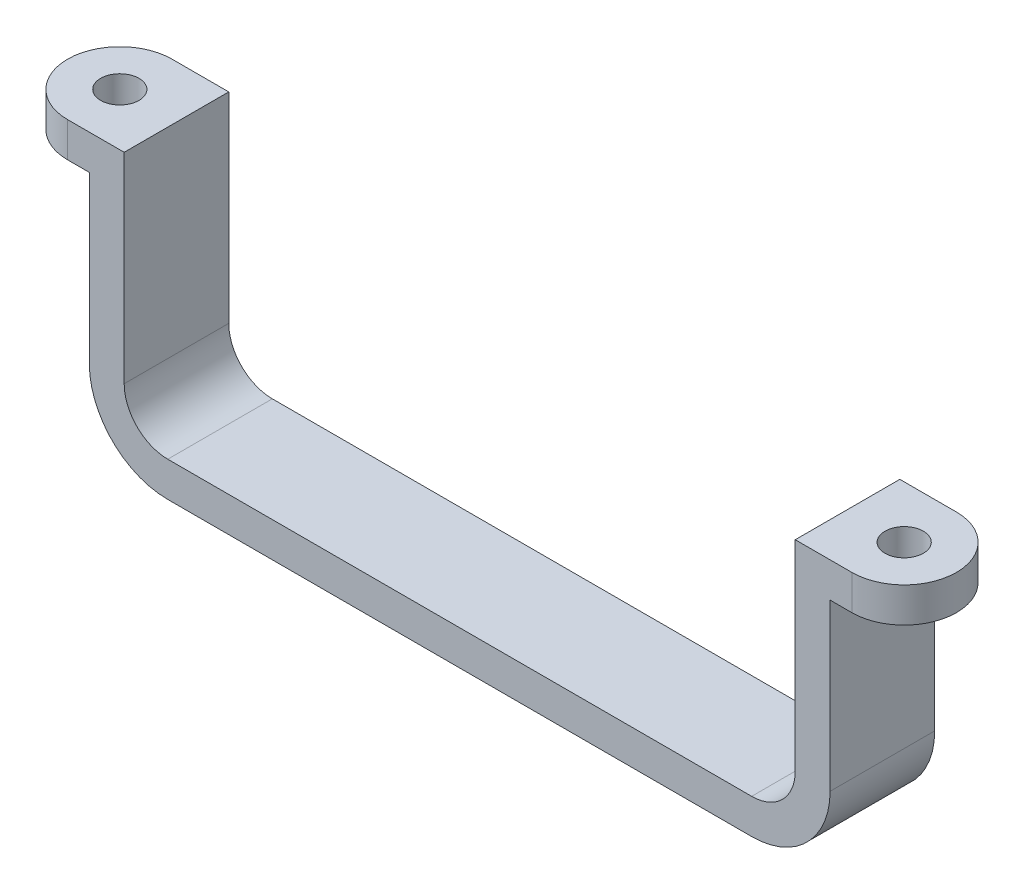
ISO-10303-21;
HEADER;
FILE_DESCRIPTION(('STEP AP214'),'2;1');
FILE_NAME('part.step','',(''),(''),'','','');
FILE_SCHEMA(('AUTOMOTIVE_DESIGN { 1 0 10303 214 1 1 1 1 }'));
ENDSEC;
DATA;
#1=APPLICATION_CONTEXT('core data for automotive mechanical design processes');
#2=APPLICATION_PROTOCOL_DEFINITION('international standard','automotive_design',2000,#1);
#3=PRODUCT_CONTEXT('',#1,'mechanical');
#4=PRODUCT('Part','Part','',(#3));
#5=PRODUCT_RELATED_PRODUCT_CATEGORY('part','',(#4));
#6=PRODUCT_DEFINITION_FORMATION('','',#4);
#7=PRODUCT_DEFINITION_CONTEXT('part definition',#1,'design');
#8=PRODUCT_DEFINITION('design','',#6,#7);
#9=PRODUCT_DEFINITION_SHAPE('','',#8);
#10=(LENGTH_UNIT() NAMED_UNIT(*) SI_UNIT(.MILLI.,.METRE.));
#11=(NAMED_UNIT(*) PLANE_ANGLE_UNIT() SI_UNIT($,.RADIAN.));
#12=(NAMED_UNIT(*) SI_UNIT($,.STERADIAN.) SOLID_ANGLE_UNIT());
#13=UNCERTAINTY_MEASURE_WITH_UNIT(LENGTH_MEASURE(1.E-05),#10,'distance_accuracy_value','');
#14=(GEOMETRIC_REPRESENTATION_CONTEXT(3) GLOBAL_UNCERTAINTY_ASSIGNED_CONTEXT((#13)) GLOBAL_UNIT_ASSIGNED_CONTEXT((#10,
#11,#12)) REPRESENTATION_CONTEXT('',''));
#15=CARTESIAN_POINT('',(0.,0.,0.));
#16=DIRECTION('',(0.,0.,1.));
#17=DIRECTION('',(1.,0.,0.));
#18=AXIS2_PLACEMENT_3D('',#15,#16,#17);
#19=CARTESIAN_POINT('',(21.25,14.,6.));
#20=DIRECTION('',(-1.,0.,0.));
#21=DIRECTION('',(0.,0.,1.));
#22=AXIS2_PLACEMENT_3D('',#19,#20,#21);
#23=PLANE('',#22);
#24=DIRECTION('',(0.,0.,-1.));
#25=VECTOR('',#24,1.);
#26=CARTESIAN_POINT('',(21.25,12.,0.));
#27=LINE('',#26,#25);
#28=CARTESIAN_POINT('',(21.25,12.,6.));
#29=VERTEX_POINT('',#28);
#30=CARTESIAN_POINT('',(21.25,12.,0.));
#31=VERTEX_POINT('',#30);
#32=EDGE_CURVE('E54',#29,#31,#27,.T.);
#33=ORIENTED_EDGE('',*,*,#32,.F.);
#34=DIRECTION('',(0.,1.,0.));
#35=VECTOR('',#34,1.);
#36=CARTESIAN_POINT('',(21.25,14.,6.));
#37=LINE('',#36,#35);
#38=CARTESIAN_POINT('',(21.25,2.5,6.));
#39=VERTEX_POINT('',#38);
#40=EDGE_CURVE('E235',#39,#29,#37,.T.);
#41=ORIENTED_EDGE('',*,*,#40,.F.);
#42=DIRECTION('',(0.,0.,-1.));
#43=VECTOR('',#42,1.);
#44=CARTESIAN_POINT('',(21.25,2.5,6.));
#45=LINE('',#44,#43);
#46=CARTESIAN_POINT('',(21.25,2.5,0.));
#47=VERTEX_POINT('',#46);
#48=EDGE_CURVE('E268',#39,#47,#45,.T.);
#49=ORIENTED_EDGE('',*,*,#48,.T.);
#50=DIRECTION('',(0.,1.,0.));
#51=VECTOR('',#50,1.);
#52=CARTESIAN_POINT('',(21.25,14.,0.));
#53=LINE('',#52,#51);
#54=EDGE_CURVE('E59',#47,#31,#53,.T.);
#55=ORIENTED_EDGE('',*,*,#54,.T.);
#56=EDGE_LOOP('',(#33,#41,#49,#55));
#57=FACE_BOUND('',#56,.T.);
#58=ADVANCED_FACE('F39',(#57),#23,.F.);
#59=CARTESIAN_POINT('',(-21.25,14.,6.));
#60=DIRECTION('',(1.,0.,0.));
#61=DIRECTION('',(0.,0.,-1.));
#62=AXIS2_PLACEMENT_3D('',#59,#60,#61);
#63=PLANE('',#62);
#64=DIRECTION('',(0.,0.,-1.));
#65=VECTOR('',#64,1.);
#66=CARTESIAN_POINT('',(-21.25,12.,0.));
#67=LINE('',#66,#65);
#68=CARTESIAN_POINT('',(-21.25,12.,6.));
#69=VERTEX_POINT('',#68);
#70=CARTESIAN_POINT('',(-21.25,12.,0.));
#71=VERTEX_POINT('',#70);
#72=EDGE_CURVE('E195',#69,#71,#67,.T.);
#73=ORIENTED_EDGE('',*,*,#72,.T.);
#74=DIRECTION('',(0.,-1.,0.));
#75=VECTOR('',#74,1.);
#76=CARTESIAN_POINT('',(-21.25,14.,0.));
#77=LINE('',#76,#75);
#78=CARTESIAN_POINT('',(-21.25,2.5,0.));
#79=VERTEX_POINT('',#78);
#80=EDGE_CURVE('E252',#71,#79,#77,.T.);
#81=ORIENTED_EDGE('',*,*,#80,.T.);
#82=DIRECTION('',(0.,0.,-1.));
#83=VECTOR('',#82,1.);
#84=CARTESIAN_POINT('',(-21.25,2.5,6.));
#85=LINE('',#84,#83);
#86=CARTESIAN_POINT('',(-21.25,2.5,6.));
#87=VERTEX_POINT('',#86);
#88=EDGE_CURVE('E276',#87,#79,#85,.T.);
#89=ORIENTED_EDGE('',*,*,#88,.F.);
#90=DIRECTION('',(0.,-1.,0.));
#91=VECTOR('',#90,1.);
#92=CARTESIAN_POINT('',(-21.25,14.,6.));
#93=LINE('',#92,#91);
#94=EDGE_CURVE('E227',#69,#87,#93,.T.);
#95=ORIENTED_EDGE('',*,*,#94,.F.);
#96=EDGE_LOOP('',(#73,#81,#89,#95));
#97=FACE_BOUND('',#96,.T.);
#98=ADVANCED_FACE('F319',(#97),#63,.F.);
#99=CARTESIAN_POINT('',(16.75,2.5,6.));
#100=DIRECTION('',(0.,0.,-1.));
#101=DIRECTION('',(-1.,0.,0.));
#102=AXIS2_PLACEMENT_3D('',#99,#100,#101);
#103=CYLINDRICAL_SURFACE('',#102,2.5);
#104=CARTESIAN_POINT('',(16.75,2.5,0.));
#105=DIRECTION('',(0.,0.,-1.));
#106=DIRECTION('',(1.,0.,0.));
#107=AXIS2_PLACEMENT_3D('',#104,#105,#106);
#108=CIRCLE('',#107,2.5);
#109=CARTESIAN_POINT('',(19.25,2.5,0.));
#110=VERTEX_POINT('',#109);
#111=CARTESIAN_POINT('',(16.75,0.,0.));
#112=VERTEX_POINT('',#111);
#113=EDGE_CURVE('E212',#110,#112,#108,.T.);
#114=ORIENTED_EDGE('',*,*,#113,.T.);
#115=DIRECTION('',(0.,0.,-1.));
#116=VECTOR('',#115,1.);
#117=CARTESIAN_POINT('',(16.75,0.,6.));
#118=LINE('',#117,#116);
#119=CARTESIAN_POINT('',(16.75,0.,6.));
#120=VERTEX_POINT('',#119);
#121=EDGE_CURVE('E11',#120,#112,#118,.T.);
#122=ORIENTED_EDGE('',*,*,#121,.F.);
#123=CARTESIAN_POINT('',(16.75,2.5,6.));
#124=DIRECTION('',(0.,0.,-1.));
#125=DIRECTION('',(1.,0.,0.));
#126=AXIS2_PLACEMENT_3D('',#123,#124,#125);
#127=CIRCLE('',#126,2.5);
#128=CARTESIAN_POINT('',(19.25,2.5,6.));
#129=VERTEX_POINT('',#128);
#130=EDGE_CURVE('E215',#129,#120,#127,.T.);
#131=ORIENTED_EDGE('',*,*,#130,.F.);
#132=DIRECTION('',(0.,0.,-1.));
#133=VECTOR('',#132,1.);
#134=CARTESIAN_POINT('',(19.25,2.5,6.));
#135=LINE('',#134,#133);
#136=EDGE_CURVE('E241',#129,#110,#135,.T.);
#137=ORIENTED_EDGE('',*,*,#136,.T.);
#138=EDGE_LOOP('',(#114,#122,#131,#137));
#139=FACE_BOUND('',#138,.T.);
#140=ADVANCED_FACE('F41',(#139),#103,.F.);
#141=CARTESIAN_POINT('',(-16.75,0.,6.));
#142=DIRECTION('',(0.,-1.,0.));
#143=DIRECTION('',(0.,0.,-1.));
#144=AXIS2_PLACEMENT_3D('',#141,#142,#143);
#145=PLANE('',#144);
#146=DIRECTION('',(-1.,0.,0.));
#147=VECTOR('',#146,1.);
#148=CARTESIAN_POINT('',(-16.75,0.,0.));
#149=LINE('',#148,#147);
#150=CARTESIAN_POINT('',(-16.75,0.,0.));
#151=VERTEX_POINT('',#150);
#152=EDGE_CURVE('E244',#112,#151,#149,.T.);
#153=ORIENTED_EDGE('',*,*,#152,.T.);
#154=DIRECTION('',(0.,0.,-1.));
#155=VECTOR('',#154,1.);
#156=CARTESIAN_POINT('',(-16.75,0.,6.));
#157=LINE('',#156,#155);
#158=CARTESIAN_POINT('',(-16.75,0.,6.));
#159=VERTEX_POINT('',#158);
#160=EDGE_CURVE('E47',#159,#151,#157,.T.);
#161=ORIENTED_EDGE('',*,*,#160,.F.);
#162=DIRECTION('',(-1.,0.,0.));
#163=VECTOR('',#162,1.);
#164=CARTESIAN_POINT('',(-16.75,0.,6.));
#165=LINE('',#164,#163);
#166=EDGE_CURVE('E218',#120,#159,#165,.T.);
#167=ORIENTED_EDGE('',*,*,#166,.F.);
#168=ORIENTED_EDGE('',*,*,#121,.T.);
#169=EDGE_LOOP('',(#153,#161,#167,#168));
#170=FACE_BOUND('',#169,.T.);
#171=ADVANCED_FACE('F354',(#170),#145,.F.);
#172=CARTESIAN_POINT('',(-16.75,2.5,6.));
#173=DIRECTION('',(0.,0.,-1.));
#174=DIRECTION('',(-1.,0.,0.));
#175=AXIS2_PLACEMENT_3D('',#172,#173,#174);
#176=CYLINDRICAL_SURFACE('',#175,2.5);
#177=CARTESIAN_POINT('',(-16.75,2.5,0.));
#178=DIRECTION('',(0.,0.,-1.));
#179=DIRECTION('',(1.,0.,0.));
#180=AXIS2_PLACEMENT_3D('',#177,#178,#179);
#181=CIRCLE('',#180,2.5);
#182=CARTESIAN_POINT('',(-19.25,2.5,0.));
#183=VERTEX_POINT('',#182);
#184=EDGE_CURVE('E246',#151,#183,#181,.T.);
#185=ORIENTED_EDGE('',*,*,#184,.T.);
#186=DIRECTION('',(0.,0.,-1.));
#187=VECTOR('',#186,1.);
#188=CARTESIAN_POINT('',(-19.25,2.5,6.));
#189=LINE('',#188,#187);
#190=CARTESIAN_POINT('',(-19.25,2.5,6.));
#191=VERTEX_POINT('',#190);
#192=EDGE_CURVE('E282',#191,#183,#189,.T.);
#193=ORIENTED_EDGE('',*,*,#192,.F.);
#194=CARTESIAN_POINT('',(-16.75,2.5,6.));
#195=DIRECTION('',(0.,0.,-1.));
#196=DIRECTION('',(1.,0.,0.));
#197=AXIS2_PLACEMENT_3D('',#194,#195,#196);
#198=CIRCLE('',#197,2.5);
#199=EDGE_CURVE('E221',#159,#191,#198,.T.);
#200=ORIENTED_EDGE('',*,*,#199,.F.);
#201=ORIENTED_EDGE('',*,*,#160,.T.);
#202=EDGE_LOOP('',(#185,#193,#200,#201));
#203=FACE_BOUND('',#202,.T.);
#204=ADVANCED_FACE('F289',(#203),#176,.F.);
#205=CARTESIAN_POINT('',(-19.25,14.,6.));
#206=DIRECTION('',(-1.,0.,0.));
#207=DIRECTION('',(0.,-1.,0.));
#208=AXIS2_PLACEMENT_3D('',#205,#206,#207);
#209=PLANE('',#208);
#210=DIRECTION('',(0.,1.,0.));
#211=VECTOR('',#210,1.);
#212=CARTESIAN_POINT('',(-19.25,14.,0.));
#213=LINE('',#212,#211);
#214=CARTESIAN_POINT('',(-19.25,14.,0.));
#215=VERTEX_POINT('',#214);
#216=EDGE_CURVE('E248',#183,#215,#213,.T.);
#217=ORIENTED_EDGE('',*,*,#216,.T.);
#218=DIRECTION('',(0.,0.,-1.));
#219=VECTOR('',#218,1.);
#220=CARTESIAN_POINT('',(-19.25,14.,6.));
#221=LINE('',#220,#219);
#222=CARTESIAN_POINT('',(-19.25,14.,6.));
#223=VERTEX_POINT('',#222);
#224=EDGE_CURVE('E279',#223,#215,#221,.T.);
#225=ORIENTED_EDGE('',*,*,#224,.F.);
#226=DIRECTION('',(0.,1.,0.));
#227=VECTOR('',#226,1.);
#228=CARTESIAN_POINT('',(-19.25,14.,6.));
#229=LINE('',#228,#227);
#230=EDGE_CURVE('E223',#191,#223,#229,.T.);
#231=ORIENTED_EDGE('',*,*,#230,.F.);
#232=ORIENTED_EDGE('',*,*,#192,.T.);
#233=EDGE_LOOP('',(#217,#225,#231,#232));
#234=FACE_BOUND('',#233,.T.);
#235=ADVANCED_FACE('F296',(#234),#209,.F.);
#236=CARTESIAN_POINT('',(-21.25,14.,6.));
#237=DIRECTION('',(0.,-1.,0.));
#238=DIRECTION('',(0.,0.,-1.));
#239=AXIS2_PLACEMENT_3D('',#236,#237,#238);
#240=PLANE('',#239);
#241=DIRECTION('',(-1.,0.,0.));
#242=VECTOR('',#241,1.);
#243=CARTESIAN_POINT('',(-21.25,14.,0.));
#244=LINE('',#243,#242);
#245=CARTESIAN_POINT('',(-22.5,14.,0.));
#246=VERTEX_POINT('',#245);
#247=EDGE_CURVE('E250',#215,#246,#244,.T.);
#248=ORIENTED_EDGE('',*,*,#247,.T.);
#249=CARTESIAN_POINT('',(-22.5,14.,3.));
#250=DIRECTION('',(0.,1.,0.));
#251=DIRECTION('',(0.,0.,1.));
#252=AXIS2_PLACEMENT_3D('',#249,#250,#251);
#253=CIRCLE('',#252,3.00000000000005);
#254=CARTESIAN_POINT('',(-22.5,14.,6.00000000000002));
#255=VERTEX_POINT('',#254);
#256=EDGE_CURVE('E187',#255,#246,#253,.F.);
#257=ORIENTED_EDGE('',*,*,#256,.F.);
#258=DIRECTION('',(-1.,0.,0.));
#259=VECTOR('',#258,1.);
#260=CARTESIAN_POINT('',(-21.25,14.,6.));
#261=LINE('',#260,#259);
#262=EDGE_CURVE('E225',#223,#255,#261,.T.);
#263=ORIENTED_EDGE('',*,*,#262,.F.);
#264=ORIENTED_EDGE('',*,*,#224,.T.);
#265=EDGE_LOOP('',(#248,#257,#263,#264));
#266=FACE_BOUND('',#265,.T.);
#267=CARTESIAN_POINT('',(-22.5,14.,3.));
#268=DIRECTION('',(0.,1.,0.));
#269=DIRECTION('',(0.,0.,1.));
#270=AXIS2_PLACEMENT_3D('',#267,#268,#269);
#271=CIRCLE('',#270,1.10000000000004);
#272=CARTESIAN_POINT('',(-22.5,14.,4.10000000000004));
#273=VERTEX_POINT('',#272);
#274=EDGE_CURVE('E193',#273,#273,#271,.F.);
#275=ORIENTED_EDGE('',*,*,#274,.T.);
#276=EDGE_LOOP('',(#275));
#277=FACE_BOUND('',#276,.T.);
#278=ADVANCED_FACE('F300',(#266,#277),#240,.F.);
#279=CARTESIAN_POINT('',(-16.75,2.5,6.));
#280=DIRECTION('',(0.,0.,-1.));
#281=DIRECTION('',(-1.,0.,0.));
#282=AXIS2_PLACEMENT_3D('',#279,#280,#281);
#283=CYLINDRICAL_SURFACE('',#282,4.5);
#284=CARTESIAN_POINT('',(-16.75,2.5,0.));
#285=DIRECTION('',(0.,0.,1.));
#286=DIRECTION('',(1.,0.,0.));
#287=AXIS2_PLACEMENT_3D('',#284,#285,#286);
#288=CIRCLE('',#287,4.5);
#289=CARTESIAN_POINT('',(-16.75,-2.,0.));
#290=VERTEX_POINT('',#289);
#291=EDGE_CURVE('E254',#79,#290,#288,.T.);
#292=ORIENTED_EDGE('',*,*,#291,.T.);
#293=DIRECTION('',(0.,0.,-1.));
#294=VECTOR('',#293,1.);
#295=CARTESIAN_POINT('',(-16.75,-2.,6.));
#296=LINE('',#295,#294);
#297=CARTESIAN_POINT('',(-16.75,-2.,6.));
#298=VERTEX_POINT('',#297);
#299=EDGE_CURVE('E273',#298,#290,#296,.T.);
#300=ORIENTED_EDGE('',*,*,#299,.F.);
#301=CARTESIAN_POINT('',(-16.75,2.5,6.));
#302=DIRECTION('',(0.,0.,1.));
#303=DIRECTION('',(1.,0.,0.));
#304=AXIS2_PLACEMENT_3D('',#301,#302,#303);
#305=CIRCLE('',#304,4.5);
#306=EDGE_CURVE('E229',#87,#298,#305,.T.);
#307=ORIENTED_EDGE('',*,*,#306,.F.);
#308=ORIENTED_EDGE('',*,*,#88,.T.);
#309=EDGE_LOOP('',(#292,#300,#307,#308));
#310=FACE_BOUND('',#309,.T.);
#311=ADVANCED_FACE('F322',(#310),#283,.T.);
#312=CARTESIAN_POINT('',(-16.75,-2.,6.));
#313=DIRECTION('',(0.,1.,0.));
#314=DIRECTION('',(0.,0.,1.));
#315=AXIS2_PLACEMENT_3D('',#312,#313,#314);
#316=PLANE('',#315);
#317=DIRECTION('',(1.,0.,0.));
#318=VECTOR('',#317,1.);
#319=CARTESIAN_POINT('',(-16.75,-2.,0.));
#320=LINE('',#319,#318);
#321=CARTESIAN_POINT('',(16.75,-2.,0.));
#322=VERTEX_POINT('',#321);
#323=EDGE_CURVE('E256',#290,#322,#320,.T.);
#324=ORIENTED_EDGE('',*,*,#323,.T.);
#325=DIRECTION('',(0.,0.,-1.));
#326=VECTOR('',#325,1.);
#327=CARTESIAN_POINT('',(16.75,-2.,6.));
#328=LINE('',#327,#326);
#329=CARTESIAN_POINT('',(16.75,-2.,6.));
#330=VERTEX_POINT('',#329);
#331=EDGE_CURVE('E270',#330,#322,#328,.T.);
#332=ORIENTED_EDGE('',*,*,#331,.F.);
#333=DIRECTION('',(1.,0.,0.));
#334=VECTOR('',#333,1.);
#335=CARTESIAN_POINT('',(-16.75,-2.,6.));
#336=LINE('',#335,#334);
#337=EDGE_CURVE('E231',#298,#330,#336,.T.);
#338=ORIENTED_EDGE('',*,*,#337,.F.);
#339=ORIENTED_EDGE('',*,*,#299,.T.);
#340=EDGE_LOOP('',(#324,#332,#338,#339));
#341=FACE_BOUND('',#340,.T.);
#342=ADVANCED_FACE('F327',(#341),#316,.F.);
#343=CARTESIAN_POINT('',(16.75,2.5,6.));
#344=DIRECTION('',(0.,0.,-1.));
#345=DIRECTION('',(-1.,0.,0.));
#346=AXIS2_PLACEMENT_3D('',#343,#344,#345);
#347=CYLINDRICAL_SURFACE('',#346,4.5);
#348=CARTESIAN_POINT('',(16.75,2.5,0.));
#349=DIRECTION('',(0.,0.,1.));
#350=DIRECTION('',(1.,0.,0.));
#351=AXIS2_PLACEMENT_3D('',#348,#349,#350);
#352=CIRCLE('',#351,4.5);
#353=EDGE_CURVE('E258',#322,#47,#352,.T.);
#354=ORIENTED_EDGE('',*,*,#353,.T.);
#355=ORIENTED_EDGE('',*,*,#48,.F.);
#356=CARTESIAN_POINT('',(16.75,2.5,6.));
#357=DIRECTION('',(0.,0.,1.));
#358=DIRECTION('',(1.,0.,0.));
#359=AXIS2_PLACEMENT_3D('',#356,#357,#358);
#360=CIRCLE('',#359,4.5);
#361=EDGE_CURVE('E233',#330,#39,#360,.T.);
#362=ORIENTED_EDGE('',*,*,#361,.F.);
#363=ORIENTED_EDGE('',*,*,#331,.T.);
#364=EDGE_LOOP('',(#354,#355,#362,#363));
#365=FACE_BOUND('',#364,.T.);
#366=ADVANCED_FACE('F331',(#365),#347,.T.);
#367=CARTESIAN_POINT('',(19.25,14.,6.));
#368=DIRECTION('',(0.,-1.,0.));
#369=DIRECTION('',(0.,0.,-1.));
#370=AXIS2_PLACEMENT_3D('',#367,#368,#369);
#371=PLANE('',#370);
#372=DIRECTION('',(-1.,0.,0.));
#373=VECTOR('',#372,1.);
#374=CARTESIAN_POINT('',(19.25,14.,0.));
#375=LINE('',#374,#373);
#376=CARTESIAN_POINT('',(22.5,14.,0.));
#377=VERTEX_POINT('',#376);
#378=CARTESIAN_POINT('',(19.25,14.,0.));
#379=VERTEX_POINT('',#378);
#380=EDGE_CURVE('E165',#377,#379,#375,.T.);
#381=ORIENTED_EDGE('',*,*,#380,.T.);
#382=DIRECTION('',(0.,0.,-1.));
#383=VECTOR('',#382,1.);
#384=CARTESIAN_POINT('',(19.25,14.,6.));
#385=LINE('',#384,#383);
#386=CARTESIAN_POINT('',(19.25,14.,6.));
#387=VERTEX_POINT('',#386);
#388=EDGE_CURVE('E265',#387,#379,#385,.T.);
#389=ORIENTED_EDGE('',*,*,#388,.F.);
#390=DIRECTION('',(-1.,0.,0.));
#391=VECTOR('',#390,1.);
#392=CARTESIAN_POINT('',(19.25,14.,6.));
#393=LINE('',#392,#391);
#394=CARTESIAN_POINT('',(22.5,14.,6.));
#395=VERTEX_POINT('',#394);
#396=EDGE_CURVE('E237',#395,#387,#393,.T.);
#397=ORIENTED_EDGE('',*,*,#396,.F.);
#398=CARTESIAN_POINT('',(22.5,14.,3.));
#399=DIRECTION('',(0.,1.,0.));
#400=DIRECTION('',(0.,0.,1.));
#401=AXIS2_PLACEMENT_3D('',#398,#399,#400);
#402=CIRCLE('',#401,3.);
#403=EDGE_CURVE('E178',#395,#377,#402,.T.);
#404=ORIENTED_EDGE('',*,*,#403,.T.);
#405=EDGE_LOOP('',(#381,#389,#397,#404));
#406=FACE_BOUND('',#405,.T.);
#407=CARTESIAN_POINT('',(22.5,14.,3.));
#408=DIRECTION('',(0.,1.,0.));
#409=DIRECTION('',(0.,0.,1.));
#410=AXIS2_PLACEMENT_3D('',#407,#408,#409);
#411=CIRCLE('',#410,1.1);
#412=CARTESIAN_POINT('',(22.5,14.,4.1));
#413=VERTEX_POINT('',#412);
#414=EDGE_CURVE('E183',#413,#413,#411,.T.);
#415=ORIENTED_EDGE('',*,*,#414,.F.);
#416=EDGE_LOOP('',(#415));
#417=FACE_BOUND('',#416,.T.);
#418=ADVANCED_FACE('F341',(#406,#417),#371,.F.);
#419=CARTESIAN_POINT('',(19.25,14.,6.));
#420=DIRECTION('',(1.,0.,0.));
#421=DIRECTION('',(0.,1.,0.));
#422=AXIS2_PLACEMENT_3D('',#419,#420,#421);
#423=PLANE('',#422);
#424=DIRECTION('',(0.,-1.,0.));
#425=VECTOR('',#424,1.);
#426=CARTESIAN_POINT('',(19.25,14.,0.));
#427=LINE('',#426,#425);
#428=EDGE_CURVE('E219',#379,#110,#427,.T.);
#429=ORIENTED_EDGE('',*,*,#428,.T.);
#430=ORIENTED_EDGE('',*,*,#136,.F.);
#431=DIRECTION('',(0.,-1.,0.));
#432=VECTOR('',#431,1.);
#433=CARTESIAN_POINT('',(19.25,14.,6.));
#434=LINE('',#433,#432);
#435=EDGE_CURVE('E239',#387,#129,#434,.T.);
#436=ORIENTED_EDGE('',*,*,#435,.F.);
#437=ORIENTED_EDGE('',*,*,#388,.T.);
#438=EDGE_LOOP('',(#429,#430,#436,#437));
#439=FACE_BOUND('',#438,.T.);
#440=ADVANCED_FACE('F364',(#439),#423,.F.);
#441=CARTESIAN_POINT('',(16.75,2.5,6.));
#442=DIRECTION('',(0.,0.,1.));
#443=DIRECTION('',(1.,0.,0.));
#444=AXIS2_PLACEMENT_3D('',#441,#442,#443);
#445=PLANE('',#444);
#446=ORIENTED_EDGE('',*,*,#130,.T.);
#447=ORIENTED_EDGE('',*,*,#166,.T.);
#448=ORIENTED_EDGE('',*,*,#199,.T.);
#449=ORIENTED_EDGE('',*,*,#230,.T.);
#450=ORIENTED_EDGE('',*,*,#262,.T.);
#451=DIRECTION('',(0.,1.,0.));
#452=VECTOR('',#451,1.);
#453=CARTESIAN_POINT('',(-22.5,12.,6.00000000000002));
#454=LINE('',#453,#452);
#455=CARTESIAN_POINT('',(-22.5,12.,6.00000000000002));
#456=VERTEX_POINT('',#455);
#457=EDGE_CURVE('E204',#456,#255,#454,.T.);
#458=ORIENTED_EDGE('',*,*,#457,.F.);
#459=DIRECTION('',(-1.,0.,0.));
#460=VECTOR('',#459,1.);
#461=CARTESIAN_POINT('',(0.,12.,6.));
#462=LINE('',#461,#460);
#463=EDGE_CURVE('E192',#69,#456,#462,.T.);
#464=ORIENTED_EDGE('',*,*,#463,.F.);
#465=ORIENTED_EDGE('',*,*,#94,.T.);
#466=ORIENTED_EDGE('',*,*,#306,.T.);
#467=ORIENTED_EDGE('',*,*,#337,.T.);
#468=ORIENTED_EDGE('',*,*,#361,.T.);
#469=ORIENTED_EDGE('',*,*,#40,.T.);
#470=DIRECTION('',(-1.,0.,0.));
#471=VECTOR('',#470,1.);
#472=CARTESIAN_POINT('',(0.,12.,6.));
#473=LINE('',#472,#471);
#474=CARTESIAN_POINT('',(22.5,12.,6.));
#475=VERTEX_POINT('',#474);
#476=EDGE_CURVE('E170',#475,#29,#473,.T.);
#477=ORIENTED_EDGE('',*,*,#476,.F.);
#478=DIRECTION('',(0.,1.,0.));
#479=VECTOR('',#478,1.);
#480=CARTESIAN_POINT('',(22.5,12.,6.));
#481=LINE('',#480,#479);
#482=EDGE_CURVE('E169',#475,#395,#481,.T.);
#483=ORIENTED_EDGE('',*,*,#482,.T.);
#484=ORIENTED_EDGE('',*,*,#396,.T.);
#485=ORIENTED_EDGE('',*,*,#435,.T.);
#486=EDGE_LOOP('',(#446,#447,#448,#449,#450,#458,#464,#465,#466,#467,#468,#469,#477,#483,#484,#485));
#487=FACE_BOUND('',#486,.T.);
#488=ADVANCED_FACE('F305',(#487),#445,.T.);
#489=CARTESIAN_POINT('',(16.75,2.5,0.));
#490=DIRECTION('',(0.,0.,1.));
#491=DIRECTION('',(1.,0.,0.));
#492=AXIS2_PLACEMENT_3D('',#489,#490,#491);
#493=PLANE('',#492);
#494=ORIENTED_EDGE('',*,*,#113,.F.);
#495=ORIENTED_EDGE('',*,*,#428,.F.);
#496=ORIENTED_EDGE('',*,*,#380,.F.);
#497=DIRECTION('',(0.,1.,0.));
#498=VECTOR('',#497,1.);
#499=CARTESIAN_POINT('',(22.5,12.,0.));
#500=LINE('',#499,#498);
#501=CARTESIAN_POINT('',(22.5,12.,0.));
#502=VERTEX_POINT('',#501);
#503=EDGE_CURVE('E161',#502,#377,#500,.T.);
#504=ORIENTED_EDGE('',*,*,#503,.F.);
#505=DIRECTION('',(1.,0.,0.));
#506=VECTOR('',#505,1.);
#507=CARTESIAN_POINT('',(0.,12.,0.));
#508=LINE('',#507,#506);
#509=EDGE_CURVE('E152',#31,#502,#508,.T.);
#510=ORIENTED_EDGE('',*,*,#509,.F.);
#511=ORIENTED_EDGE('',*,*,#54,.F.);
#512=ORIENTED_EDGE('',*,*,#353,.F.);
#513=ORIENTED_EDGE('',*,*,#323,.F.);
#514=ORIENTED_EDGE('',*,*,#291,.F.);
#515=ORIENTED_EDGE('',*,*,#80,.F.);
#516=DIRECTION('',(1.,0.,0.));
#517=VECTOR('',#516,1.);
#518=CARTESIAN_POINT('',(0.,12.,0.));
#519=LINE('',#518,#517);
#520=CARTESIAN_POINT('',(-22.5,12.,0.));
#521=VERTEX_POINT('',#520);
#522=EDGE_CURVE('E198',#521,#71,#519,.T.);
#523=ORIENTED_EDGE('',*,*,#522,.F.);
#524=DIRECTION('',(0.,1.,0.));
#525=VECTOR('',#524,1.);
#526=CARTESIAN_POINT('',(-22.5,12.,0.));
#527=LINE('',#526,#525);
#528=EDGE_CURVE('E209',#521,#246,#527,.T.);
#529=ORIENTED_EDGE('',*,*,#528,.T.);
#530=ORIENTED_EDGE('',*,*,#247,.F.);
#531=ORIENTED_EDGE('',*,*,#216,.F.);
#532=ORIENTED_EDGE('',*,*,#184,.F.);
#533=ORIENTED_EDGE('',*,*,#152,.F.);
#534=EDGE_LOOP('',(#494,#495,#496,#504,#510,#511,#512,#513,#514,#515,#523,#529,#530,#531,#532,#533));
#535=FACE_BOUND('',#534,.T.);
#536=ADVANCED_FACE('F163',(#535),#493,.F.);
#537=CARTESIAN_POINT('',(-22.5,12.,3.));
#538=DIRECTION('',(0.,1.,0.));
#539=DIRECTION('',(0.,0.,1.));
#540=AXIS2_PLACEMENT_3D('',#537,#538,#539);
#541=CYLINDRICAL_SURFACE('',#540,3.00000000000005);
#542=ORIENTED_EDGE('',*,*,#256,.T.);
#543=ORIENTED_EDGE('',*,*,#528,.F.);
#544=CARTESIAN_POINT('',(-22.5,12.,3.));
#545=DIRECTION('',(0.,1.,0.));
#546=DIRECTION('',(0.,0.,1.));
#547=AXIS2_PLACEMENT_3D('',#544,#545,#546);
#548=CIRCLE('',#547,3.00000000000005);
#549=EDGE_CURVE('E189',#456,#521,#548,.F.);
#550=ORIENTED_EDGE('',*,*,#549,.F.);
#551=ORIENTED_EDGE('',*,*,#457,.T.);
#552=EDGE_LOOP('',(#542,#543,#550,#551));
#553=FACE_BOUND('',#552,.T.);
#554=ADVANCED_FACE('F309',(#553),#541,.T.);
#555=CARTESIAN_POINT('',(-22.5,12.,3.));
#556=DIRECTION('',(0.,1.,0.));
#557=DIRECTION('',(0.,0.,1.));
#558=AXIS2_PLACEMENT_3D('',#555,#556,#557);
#559=CYLINDRICAL_SURFACE('',#558,1.10000000000004);
#560=CARTESIAN_POINT('',(-22.5,12.,3.));
#561=DIRECTION('',(0.,1.,0.));
#562=DIRECTION('',(0.,0.,1.));
#563=AXIS2_PLACEMENT_3D('',#560,#561,#562);
#564=CIRCLE('',#563,1.10000000000004);
#565=CARTESIAN_POINT('',(-22.5,12.,4.10000000000004));
#566=VERTEX_POINT('',#565);
#567=EDGE_CURVE('E201',#566,#566,#564,.F.);
#568=ORIENTED_EDGE('',*,*,#567,.T.);
#569=EDGE_LOOP('',(#568));
#570=FACE_BOUND('',#569,.T.);
#571=ORIENTED_EDGE('',*,*,#274,.F.);
#572=EDGE_LOOP('',(#571));
#573=FACE_BOUND('',#572,.T.);
#574=ADVANCED_FACE('F387',(#570,#573),#559,.F.);
#575=CARTESIAN_POINT('',(0.,12.,0.));
#576=DIRECTION('',(0.,1.,0.));
#577=DIRECTION('',(0.,0.,1.));
#578=AXIS2_PLACEMENT_3D('',#575,#576,#577);
#579=PLANE('',#578);
#580=ORIENTED_EDGE('',*,*,#549,.T.);
#581=ORIENTED_EDGE('',*,*,#522,.T.);
#582=ORIENTED_EDGE('',*,*,#72,.F.);
#583=ORIENTED_EDGE('',*,*,#463,.T.);
#584=EDGE_LOOP('',(#580,#581,#582,#583));
#585=FACE_BOUND('',#584,.T.);
#586=ORIENTED_EDGE('',*,*,#567,.F.);
#587=EDGE_LOOP('',(#586));
#588=FACE_BOUND('',#587,.T.);
#589=ADVANCED_FACE('F312',(#585,#588),#579,.F.);
#590=CARTESIAN_POINT('',(22.5,12.,3.));
#591=DIRECTION('',(0.,1.,0.));
#592=DIRECTION('',(0.,0.,1.));
#593=AXIS2_PLACEMENT_3D('',#590,#591,#592);
#594=CYLINDRICAL_SURFACE('',#593,3.);
#595=ORIENTED_EDGE('',*,*,#403,.F.);
#596=ORIENTED_EDGE('',*,*,#482,.F.);
#597=CARTESIAN_POINT('',(22.5,12.,3.));
#598=DIRECTION('',(0.,1.,0.));
#599=DIRECTION('',(0.,0.,1.));
#600=AXIS2_PLACEMENT_3D('',#597,#598,#599);
#601=CIRCLE('',#600,3.);
#602=EDGE_CURVE('E157',#475,#502,#601,.T.);
#603=ORIENTED_EDGE('',*,*,#602,.T.);
#604=ORIENTED_EDGE('',*,*,#503,.T.);
#605=EDGE_LOOP('',(#595,#596,#603,#604));
#606=FACE_BOUND('',#605,.T.);
#607=ADVANCED_FACE('F172',(#606),#594,.T.);
#608=CARTESIAN_POINT('',(22.5,12.,3.));
#609=DIRECTION('',(0.,1.,0.));
#610=DIRECTION('',(0.,0.,1.));
#611=AXIS2_PLACEMENT_3D('',#608,#609,#610);
#612=CYLINDRICAL_SURFACE('',#611,1.1);
#613=CARTESIAN_POINT('',(22.5,12.,3.));
#614=DIRECTION('',(0.,1.,0.));
#615=DIRECTION('',(0.,0.,1.));
#616=AXIS2_PLACEMENT_3D('',#613,#614,#615);
#617=CIRCLE('',#616,1.1);
#618=CARTESIAN_POINT('',(22.5,12.,4.1));
#619=VERTEX_POINT('',#618);
#620=EDGE_CURVE('E175',#619,#619,#617,.T.);
#621=ORIENTED_EDGE('',*,*,#620,.F.);
#622=EDGE_LOOP('',(#621));
#623=FACE_BOUND('',#622,.T.);
#624=ORIENTED_EDGE('',*,*,#414,.T.);
#625=EDGE_LOOP('',(#624));
#626=FACE_BOUND('',#625,.T.);
#627=ADVANCED_FACE('F372',(#623,#626),#612,.F.);
#628=CARTESIAN_POINT('',(0.,12.,0.));
#629=DIRECTION('',(0.,1.,0.));
#630=DIRECTION('',(0.,0.,1.));
#631=AXIS2_PLACEMENT_3D('',#628,#629,#630);
#632=PLANE('',#631);
#633=ORIENTED_EDGE('',*,*,#620,.T.);
#634=EDGE_LOOP('',(#633));
#635=FACE_BOUND('',#634,.T.);
#636=ORIENTED_EDGE('',*,*,#602,.F.);
#637=ORIENTED_EDGE('',*,*,#476,.T.);
#638=ORIENTED_EDGE('',*,*,#32,.T.);
#639=ORIENTED_EDGE('',*,*,#509,.T.);
#640=EDGE_LOOP('',(#636,#637,#638,#639));
#641=FACE_BOUND('',#640,.T.);
#642=ADVANCED_FACE('F154',(#635,#641),#632,.F.);
#643=CLOSED_SHELL('',(#58,#98,#140,#171,#204,#235,#278,#311,#342,#366,#418,#440,#488,#536,#554,
#574,#589,#607,#627,#642));
#644=MANIFOLD_SOLID_BREP('B2',#643);
#645=ADVANCED_BREP_SHAPE_REPRESENTATION('',(#18,#644),#14);
#646=SHAPE_DEFINITION_REPRESENTATION(#9,#645);
ENDSEC;
END-ISO-10303-21;
